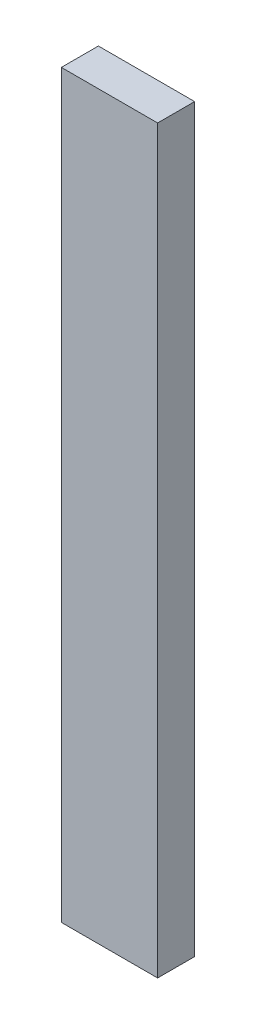
ISO-10303-21;
HEADER;
FILE_DESCRIPTION(('STEP AP214'),'2;1');
FILE_NAME('part.step','',(''),(''),'','','');
FILE_SCHEMA(('AUTOMOTIVE_DESIGN { 1 0 10303 214 1 1 1 1 }'));
ENDSEC;
DATA;
#1=APPLICATION_CONTEXT('core data for automotive mechanical design processes');
#2=APPLICATION_PROTOCOL_DEFINITION('international standard','automotive_design',2000,#1);
#3=PRODUCT_CONTEXT('',#1,'mechanical');
#4=PRODUCT('Part','Part','',(#3));
#5=PRODUCT_RELATED_PRODUCT_CATEGORY('part','',(#4));
#6=PRODUCT_DEFINITION_FORMATION('','',#4);
#7=PRODUCT_DEFINITION_CONTEXT('part definition',#1,'design');
#8=PRODUCT_DEFINITION('design','',#6,#7);
#9=PRODUCT_DEFINITION_SHAPE('','',#8);
#10=(LENGTH_UNIT() NAMED_UNIT(*) SI_UNIT(.MILLI.,.METRE.));
#11=(NAMED_UNIT(*) PLANE_ANGLE_UNIT() SI_UNIT($,.RADIAN.));
#12=(NAMED_UNIT(*) SI_UNIT($,.STERADIAN.) SOLID_ANGLE_UNIT());
#13=UNCERTAINTY_MEASURE_WITH_UNIT(LENGTH_MEASURE(1.E-05),#10,'distance_accuracy_value','');
#14=(GEOMETRIC_REPRESENTATION_CONTEXT(3) GLOBAL_UNCERTAINTY_ASSIGNED_CONTEXT((#13)) GLOBAL_UNIT_ASSIGNED_CONTEXT((#10,
#11,#12)) REPRESENTATION_CONTEXT('',''));
#15=CARTESIAN_POINT('',(0.,0.,0.));
#16=DIRECTION('',(0.,0.,1.));
#17=DIRECTION('',(1.,0.,0.));
#18=AXIS2_PLACEMENT_3D('',#15,#16,#17);
#19=CARTESIAN_POINT('',(0.,0.,100.));
#20=DIRECTION('',(1.,0.,0.));
#21=DIRECTION('',(0.,0.,-1.));
#22=AXIS2_PLACEMENT_3D('',#19,#20,#21);
#23=PLANE('',#22);
#24=DIRECTION('',(0.,-1.,0.));
#25=VECTOR('',#24,1.);
#26=CARTESIAN_POINT('',(0.,0.,0.));
#27=LINE('',#26,#25);
#28=CARTESIAN_POINT('',(0.,2000.,0.));
#29=VERTEX_POINT('',#28);
#30=CARTESIAN_POINT('',(0.,0.,0.));
#31=VERTEX_POINT('',#30);
#32=EDGE_CURVE('E96',#29,#31,#27,.T.);
#33=ORIENTED_EDGE('',*,*,#32,.T.);
#34=DIRECTION('',(0.,0.,-1.));
#35=VECTOR('',#34,1.);
#36=CARTESIAN_POINT('',(0.,0.,100.));
#37=LINE('',#36,#35);
#38=CARTESIAN_POINT('',(0.,0.,100.));
#39=VERTEX_POINT('',#38);
#40=EDGE_CURVE('E11',#39,#31,#37,.T.);
#41=ORIENTED_EDGE('',*,*,#40,.F.);
#42=DIRECTION('',(0.,-1.,0.));
#43=VECTOR('',#42,1.);
#44=CARTESIAN_POINT('',(0.,0.,100.));
#45=LINE('',#44,#43);
#46=CARTESIAN_POINT('',(0.,2000.,100.));
#47=VERTEX_POINT('',#46);
#48=EDGE_CURVE('E84',#47,#39,#45,.T.);
#49=ORIENTED_EDGE('',*,*,#48,.F.);
#50=DIRECTION('',(0.,0.,-1.));
#51=VECTOR('',#50,1.);
#52=CARTESIAN_POINT('',(0.,2000.,100.));
#53=LINE('',#52,#51);
#54=EDGE_CURVE('E92',#47,#29,#53,.T.);
#55=ORIENTED_EDGE('',*,*,#54,.T.);
#56=EDGE_LOOP('',(#33,#41,#49,#55));
#57=FACE_BOUND('',#56,.T.);
#58=ADVANCED_FACE('F33',(#57),#23,.F.);
#59=CARTESIAN_POINT('',(0.,0.,100.));
#60=DIRECTION('',(0.,1.,0.));
#61=DIRECTION('',(0.,0.,1.));
#62=AXIS2_PLACEMENT_3D('',#59,#60,#61);
#63=PLANE('',#62);
#64=DIRECTION('',(1.,0.,0.));
#65=VECTOR('',#64,1.);
#66=CARTESIAN_POINT('',(0.,0.,0.));
#67=LINE('',#66,#65);
#68=CARTESIAN_POINT('',(260.,0.,0.));
#69=VERTEX_POINT('',#68);
#70=EDGE_CURVE('E88',#31,#69,#67,.T.);
#71=ORIENTED_EDGE('',*,*,#70,.T.);
#72=DIRECTION('',(0.,0.,-1.));
#73=VECTOR('',#72,1.);
#74=CARTESIAN_POINT('',(260.,0.,100.));
#75=LINE('',#74,#73);
#76=CARTESIAN_POINT('',(260.,0.,100.));
#77=VERTEX_POINT('',#76);
#78=EDGE_CURVE('E41',#77,#69,#75,.T.);
#79=ORIENTED_EDGE('',*,*,#78,.F.);
#80=DIRECTION('',(1.,0.,0.));
#81=VECTOR('',#80,1.);
#82=CARTESIAN_POINT('',(0.,0.,100.));
#83=LINE('',#82,#81);
#84=EDGE_CURVE('E79',#39,#77,#83,.T.);
#85=ORIENTED_EDGE('',*,*,#84,.F.);
#86=ORIENTED_EDGE('',*,*,#40,.T.);
#87=EDGE_LOOP('',(#71,#79,#85,#86));
#88=FACE_BOUND('',#87,.T.);
#89=ADVANCED_FACE('F87',(#88),#63,.F.);
#90=CARTESIAN_POINT('',(260.,0.,100.));
#91=DIRECTION('',(-1.,0.,0.));
#92=DIRECTION('',(0.,0.,1.));
#93=AXIS2_PLACEMENT_3D('',#90,#91,#92);
#94=PLANE('',#93);
#95=DIRECTION('',(0.,1.,0.));
#96=VECTOR('',#95,1.);
#97=CARTESIAN_POINT('',(260.,0.,0.));
#98=LINE('',#97,#96);
#99=CARTESIAN_POINT('',(260.,2000.,0.));
#100=VERTEX_POINT('',#99);
#101=EDGE_CURVE('E66',#69,#100,#98,.T.);
#102=ORIENTED_EDGE('',*,*,#101,.T.);
#103=DIRECTION('',(0.,0.,-1.));
#104=VECTOR('',#103,1.);
#105=CARTESIAN_POINT('',(260.,2000.,100.));
#106=LINE('',#105,#104);
#107=CARTESIAN_POINT('',(260.,2000.,100.));
#108=VERTEX_POINT('',#107);
#109=EDGE_CURVE('E89',#108,#100,#106,.T.);
#110=ORIENTED_EDGE('',*,*,#109,.F.);
#111=DIRECTION('',(0.,1.,0.));
#112=VECTOR('',#111,1.);
#113=CARTESIAN_POINT('',(260.,0.,100.));
#114=LINE('',#113,#112);
#115=EDGE_CURVE('E82',#77,#108,#114,.T.);
#116=ORIENTED_EDGE('',*,*,#115,.F.);
#117=ORIENTED_EDGE('',*,*,#78,.T.);
#118=EDGE_LOOP('',(#102,#110,#116,#117));
#119=FACE_BOUND('',#118,.T.);
#120=ADVANCED_FACE('F90',(#119),#94,.F.);
#121=CARTESIAN_POINT('',(0.,2000.,100.));
#122=DIRECTION('',(0.,-1.,0.));
#123=DIRECTION('',(0.,0.,-1.));
#124=AXIS2_PLACEMENT_3D('',#121,#122,#123);
#125=PLANE('',#124);
#126=DIRECTION('',(-1.,0.,0.));
#127=VECTOR('',#126,1.);
#128=CARTESIAN_POINT('',(0.,2000.,0.));
#129=LINE('',#128,#127);
#130=EDGE_CURVE('E72',#100,#29,#129,.T.);
#131=ORIENTED_EDGE('',*,*,#130,.T.);
#132=ORIENTED_EDGE('',*,*,#54,.F.);
#133=DIRECTION('',(-1.,0.,0.));
#134=VECTOR('',#133,1.);
#135=CARTESIAN_POINT('',(0.,2000.,100.));
#136=LINE('',#135,#134);
#137=EDGE_CURVE('E49',#108,#47,#136,.T.);
#138=ORIENTED_EDGE('',*,*,#137,.F.);
#139=ORIENTED_EDGE('',*,*,#109,.T.);
#140=EDGE_LOOP('',(#131,#132,#138,#139));
#141=FACE_BOUND('',#140,.T.);
#142=ADVANCED_FACE('F103',(#141),#125,.F.);
#143=CARTESIAN_POINT('',(0.,0.,100.));
#144=DIRECTION('',(0.,0.,-1.));
#145=DIRECTION('',(-1.,0.,0.));
#146=AXIS2_PLACEMENT_3D('',#143,#144,#145);
#147=PLANE('',#146);
#148=ORIENTED_EDGE('',*,*,#48,.T.);
#149=ORIENTED_EDGE('',*,*,#84,.T.);
#150=ORIENTED_EDGE('',*,*,#115,.T.);
#151=ORIENTED_EDGE('',*,*,#137,.T.);
#152=EDGE_LOOP('',(#148,#149,#150,#151));
#153=FACE_BOUND('',#152,.T.);
#154=ADVANCED_FACE('F80',(#153),#147,.F.);
#155=CARTESIAN_POINT('',(0.,0.,0.));
#156=DIRECTION('',(0.,0.,-1.));
#157=DIRECTION('',(-1.,0.,0.));
#158=AXIS2_PLACEMENT_3D('',#155,#156,#157);
#159=PLANE('',#158);
#160=ORIENTED_EDGE('',*,*,#32,.F.);
#161=ORIENTED_EDGE('',*,*,#130,.F.);
#162=ORIENTED_EDGE('',*,*,#101,.F.);
#163=ORIENTED_EDGE('',*,*,#70,.F.);
#164=EDGE_LOOP('',(#160,#161,#162,#163));
#165=FACE_BOUND('',#164,.T.);
#166=ADVANCED_FACE('F106',(#165),#159,.T.);
#167=CLOSED_SHELL('',(#58,#89,#120,#142,#154,#166));
#168=MANIFOLD_SOLID_BREP('B2',#167);
#169=ADVANCED_BREP_SHAPE_REPRESENTATION('',(#18,#168),#14);
#170=SHAPE_DEFINITION_REPRESENTATION(#9,#169);
ENDSEC;
END-ISO-10303-21;
